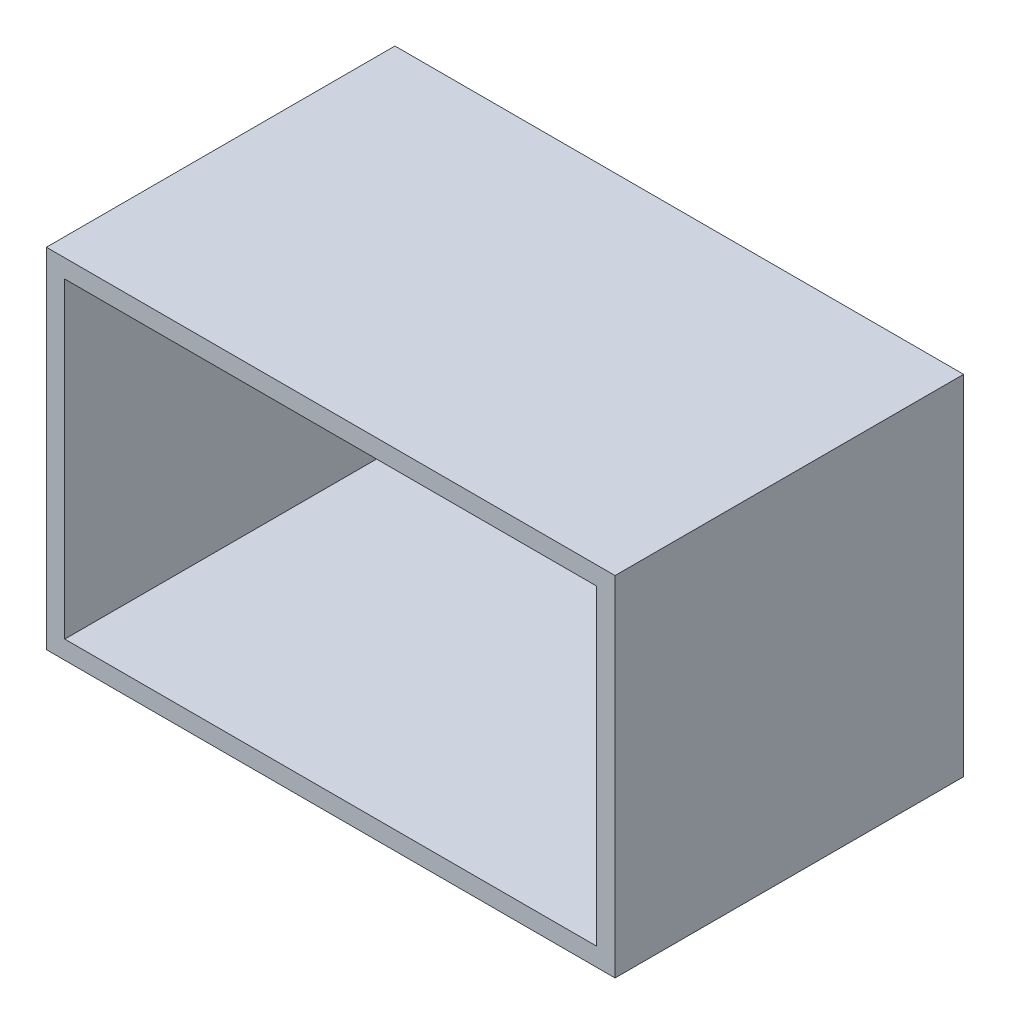
ISO-10303-21;
HEADER;
FILE_DESCRIPTION(('STEP AP214'),'2;1');
FILE_NAME('part.step','',(''),(''),'','','');
FILE_SCHEMA(('AUTOMOTIVE_DESIGN { 1 0 10303 214 1 1 1 1 }'));
ENDSEC;
DATA;
#1=APPLICATION_CONTEXT('core data for automotive mechanical design processes');
#2=APPLICATION_PROTOCOL_DEFINITION('international standard','automotive_design',2000,#1);
#3=PRODUCT_CONTEXT('',#1,'mechanical');
#4=PRODUCT('Part','Part','',(#3));
#5=PRODUCT_RELATED_PRODUCT_CATEGORY('part','',(#4));
#6=PRODUCT_DEFINITION_FORMATION('','',#4);
#7=PRODUCT_DEFINITION_CONTEXT('part definition',#1,'design');
#8=PRODUCT_DEFINITION('design','',#6,#7);
#9=PRODUCT_DEFINITION_SHAPE('','',#8);
#10=(LENGTH_UNIT() NAMED_UNIT(*) SI_UNIT(.MILLI.,.METRE.));
#11=(NAMED_UNIT(*) PLANE_ANGLE_UNIT() SI_UNIT($,.RADIAN.));
#12=(NAMED_UNIT(*) SI_UNIT($,.STERADIAN.) SOLID_ANGLE_UNIT());
#13=UNCERTAINTY_MEASURE_WITH_UNIT(LENGTH_MEASURE(1.E-05),#10,'distance_accuracy_value','');
#14=(GEOMETRIC_REPRESENTATION_CONTEXT(3) GLOBAL_UNCERTAINTY_ASSIGNED_CONTEXT((#13)) GLOBAL_UNIT_ASSIGNED_CONTEXT((#10,
#11,#12)) REPRESENTATION_CONTEXT('',''));
#15=CARTESIAN_POINT('',(0.,0.,0.));
#16=DIRECTION('',(0.,0.,1.));
#17=DIRECTION('',(1.,0.,0.));
#18=AXIS2_PLACEMENT_3D('',#15,#16,#17);
#19=CARTESIAN_POINT('',(-15.5,-9.5,19.));
#20=DIRECTION('',(1.,0.,0.));
#21=DIRECTION('',(0.,0.,-1.));
#22=AXIS2_PLACEMENT_3D('',#19,#20,#21);
#23=PLANE('',#22);
#24=DIRECTION('',(0.,-1.,0.));
#25=VECTOR('',#24,1.);
#26=CARTESIAN_POINT('',(-15.5,-9.5,0.));
#27=LINE('',#26,#25);
#28=CARTESIAN_POINT('',(-15.5,9.5,0.));
#29=VERTEX_POINT('',#28);
#30=CARTESIAN_POINT('',(-15.5,-9.5,0.));
#31=VERTEX_POINT('',#30);
#32=EDGE_CURVE('E150',#29,#31,#27,.T.);
#33=ORIENTED_EDGE('',*,*,#32,.T.);
#34=DIRECTION('',(0.,0.,-1.));
#35=VECTOR('',#34,1.);
#36=CARTESIAN_POINT('',(-15.5,-9.5,19.));
#37=LINE('',#36,#35);
#38=CARTESIAN_POINT('',(-15.5,-9.5,19.));
#39=VERTEX_POINT('',#38);
#40=EDGE_CURVE('E11',#39,#31,#37,.T.);
#41=ORIENTED_EDGE('',*,*,#40,.F.);
#42=DIRECTION('',(0.,-1.,0.));
#43=VECTOR('',#42,1.);
#44=CARTESIAN_POINT('',(-15.5,-9.5,19.));
#45=LINE('',#44,#43);
#46=CARTESIAN_POINT('',(-15.5,9.5,19.));
#47=VERTEX_POINT('',#46);
#48=EDGE_CURVE('E143',#47,#39,#45,.T.);
#49=ORIENTED_EDGE('',*,*,#48,.F.);
#50=DIRECTION('',(0.,0.,-1.));
#51=VECTOR('',#50,1.);
#52=CARTESIAN_POINT('',(-15.5,9.5,19.));
#53=LINE('',#52,#51);
#54=EDGE_CURVE('E149',#47,#29,#53,.T.);
#55=ORIENTED_EDGE('',*,*,#54,.T.);
#56=EDGE_LOOP('',(#33,#41,#49,#55));
#57=FACE_BOUND('',#56,.T.);
#58=ADVANCED_FACE('F36',(#57),#23,.F.);
#59=CARTESIAN_POINT('',(15.5,-9.5,19.));
#60=DIRECTION('',(0.,1.,0.));
#61=DIRECTION('',(0.,0.,1.));
#62=AXIS2_PLACEMENT_3D('',#59,#60,#61);
#63=PLANE('',#62);
#64=DIRECTION('',(1.,0.,0.));
#65=VECTOR('',#64,1.);
#66=CARTESIAN_POINT('',(15.5,-9.5,0.));
#67=LINE('',#66,#65);
#68=CARTESIAN_POINT('',(15.5,-9.5,0.));
#69=VERTEX_POINT('',#68);
#70=EDGE_CURVE('E153',#31,#69,#67,.T.);
#71=ORIENTED_EDGE('',*,*,#70,.T.);
#72=DIRECTION('',(0.,0.,-1.));
#73=VECTOR('',#72,1.);
#74=CARTESIAN_POINT('',(15.5,-9.5,19.));
#75=LINE('',#74,#73);
#76=CARTESIAN_POINT('',(15.5,-9.5,19.));
#77=VERTEX_POINT('',#76);
#78=EDGE_CURVE('E43',#77,#69,#75,.T.);
#79=ORIENTED_EDGE('',*,*,#78,.F.);
#80=DIRECTION('',(1.,0.,0.));
#81=VECTOR('',#80,1.);
#82=CARTESIAN_POINT('',(15.5,-9.5,19.));
#83=LINE('',#82,#81);
#84=EDGE_CURVE('E87',#39,#77,#83,.T.);
#85=ORIENTED_EDGE('',*,*,#84,.F.);
#86=ORIENTED_EDGE('',*,*,#40,.T.);
#87=EDGE_LOOP('',(#71,#79,#85,#86));
#88=FACE_BOUND('',#87,.T.);
#89=ADVANCED_FACE('F182',(#88),#63,.F.);
#90=CARTESIAN_POINT('',(15.5,-9.5,19.));
#91=DIRECTION('',(-1.,0.,0.));
#92=DIRECTION('',(0.,0.,1.));
#93=AXIS2_PLACEMENT_3D('',#90,#91,#92);
#94=PLANE('',#93);
#95=DIRECTION('',(0.,1.,0.));
#96=VECTOR('',#95,1.);
#97=CARTESIAN_POINT('',(15.5,-9.5,0.));
#98=LINE('',#97,#96);
#99=CARTESIAN_POINT('',(15.5,9.5,0.));
#100=VERTEX_POINT('',#99);
#101=EDGE_CURVE('E155',#69,#100,#98,.T.);
#102=ORIENTED_EDGE('',*,*,#101,.T.);
#103=DIRECTION('',(0.,0.,-1.));
#104=VECTOR('',#103,1.);
#105=CARTESIAN_POINT('',(15.5,9.5,19.));
#106=LINE('',#105,#104);
#107=CARTESIAN_POINT('',(15.5,9.5,19.));
#108=VERTEX_POINT('',#107);
#109=EDGE_CURVE('E159',#108,#100,#106,.T.);
#110=ORIENTED_EDGE('',*,*,#109,.F.);
#111=DIRECTION('',(0.,1.,0.));
#112=VECTOR('',#111,1.);
#113=CARTESIAN_POINT('',(15.5,-9.5,19.));
#114=LINE('',#113,#112);
#115=EDGE_CURVE('E146',#77,#108,#114,.T.);
#116=ORIENTED_EDGE('',*,*,#115,.F.);
#117=ORIENTED_EDGE('',*,*,#78,.T.);
#118=EDGE_LOOP('',(#102,#110,#116,#117));
#119=FACE_BOUND('',#118,.T.);
#120=ADVANCED_FACE('F164',(#119),#94,.F.);
#121=CARTESIAN_POINT('',(15.5,9.5,19.));
#122=DIRECTION('',(0.,-1.,0.));
#123=DIRECTION('',(0.,0.,-1.));
#124=AXIS2_PLACEMENT_3D('',#121,#122,#123);
#125=PLANE('',#124);
#126=DIRECTION('',(-1.,0.,0.));
#127=VECTOR('',#126,1.);
#128=CARTESIAN_POINT('',(15.5,9.5,0.));
#129=LINE('',#128,#127);
#130=EDGE_CURVE('E80',#100,#29,#129,.T.);
#131=ORIENTED_EDGE('',*,*,#130,.T.);
#132=ORIENTED_EDGE('',*,*,#54,.F.);
#133=DIRECTION('',(-1.,0.,0.));
#134=VECTOR('',#133,1.);
#135=CARTESIAN_POINT('',(15.5,9.5,19.));
#136=LINE('',#135,#134);
#137=EDGE_CURVE('E59',#108,#47,#136,.T.);
#138=ORIENTED_EDGE('',*,*,#137,.F.);
#139=ORIENTED_EDGE('',*,*,#109,.T.);
#140=EDGE_LOOP('',(#131,#132,#138,#139));
#141=FACE_BOUND('',#140,.T.);
#142=ADVANCED_FACE('F172',(#141),#125,.F.);
#143=CARTESIAN_POINT('',(0.,0.,19.));
#144=DIRECTION('',(0.,0.,1.));
#145=DIRECTION('',(1.,0.,0.));
#146=AXIS2_PLACEMENT_3D('',#143,#144,#145);
#147=PLANE('',#146);
#148=DIRECTION('',(0.,-1.,0.));
#149=VECTOR('',#148,1.);
#150=CARTESIAN_POINT('',(-14.5,-9.5,19.));
#151=LINE('',#150,#149);
#152=CARTESIAN_POINT('',(-14.5,8.5,19.));
#153=VERTEX_POINT('',#152);
#154=CARTESIAN_POINT('',(-14.5,-8.5,19.));
#155=VERTEX_POINT('',#154);
#156=EDGE_CURVE('E132',#153,#155,#151,.T.);
#157=ORIENTED_EDGE('',*,*,#156,.F.);
#158=DIRECTION('',(-1.,0.,0.));
#159=VECTOR('',#158,1.);
#160=CARTESIAN_POINT('',(15.5,8.5,19.));
#161=LINE('',#160,#159);
#162=CARTESIAN_POINT('',(14.5,8.5,19.));
#163=VERTEX_POINT('',#162);
#164=EDGE_CURVE('E141',#163,#153,#161,.T.);
#165=ORIENTED_EDGE('',*,*,#164,.F.);
#166=DIRECTION('',(0.,1.,0.));
#167=VECTOR('',#166,1.);
#168=CARTESIAN_POINT('',(14.5,-9.5,19.));
#169=LINE('',#168,#167);
#170=CARTESIAN_POINT('',(14.5,-8.5,19.));
#171=VERTEX_POINT('',#170);
#172=EDGE_CURVE('E139',#171,#163,#169,.T.);
#173=ORIENTED_EDGE('',*,*,#172,.F.);
#174=DIRECTION('',(1.,0.,0.));
#175=VECTOR('',#174,1.);
#176=CARTESIAN_POINT('',(15.5,-8.5,19.));
#177=LINE('',#176,#175);
#178=EDGE_CURVE('E124',#155,#171,#177,.T.);
#179=ORIENTED_EDGE('',*,*,#178,.F.);
#180=EDGE_LOOP('',(#157,#165,#173,#179));
#181=FACE_BOUND('',#180,.T.);
#182=ORIENTED_EDGE('',*,*,#48,.T.);
#183=ORIENTED_EDGE('',*,*,#84,.T.);
#184=ORIENTED_EDGE('',*,*,#115,.T.);
#185=ORIENTED_EDGE('',*,*,#137,.T.);
#186=EDGE_LOOP('',(#182,#183,#184,#185));
#187=FACE_BOUND('',#186,.T.);
#188=ADVANCED_FACE('F174',(#181,#187),#147,.T.);
#189=CARTESIAN_POINT('',(0.,0.,0.));
#190=DIRECTION('',(0.,0.,1.));
#191=DIRECTION('',(1.,0.,0.));
#192=AXIS2_PLACEMENT_3D('',#189,#190,#191);
#193=PLANE('',#192);
#194=ORIENTED_EDGE('',*,*,#32,.F.);
#195=ORIENTED_EDGE('',*,*,#130,.F.);
#196=ORIENTED_EDGE('',*,*,#101,.F.);
#197=ORIENTED_EDGE('',*,*,#70,.F.);
#198=EDGE_LOOP('',(#194,#195,#196,#197));
#199=FACE_BOUND('',#198,.T.);
#200=ADVANCED_FACE('F168',(#199),#193,.F.);
#201=CARTESIAN_POINT('',(-14.5,-9.5,19.));
#202=DIRECTION('',(1.,0.,0.));
#203=DIRECTION('',(0.,0.,-1.));
#204=AXIS2_PLACEMENT_3D('',#201,#202,#203);
#205=PLANE('',#204);
#206=DIRECTION('',(0.,-1.,0.));
#207=VECTOR('',#206,1.);
#208=CARTESIAN_POINT('',(-14.5,-9.5,1.));
#209=LINE('',#208,#207);
#210=CARTESIAN_POINT('',(-14.5,8.5,1.));
#211=VERTEX_POINT('',#210);
#212=CARTESIAN_POINT('',(-14.5,-8.5,1.));
#213=VERTEX_POINT('',#212);
#214=EDGE_CURVE('E115',#211,#213,#209,.T.);
#215=ORIENTED_EDGE('',*,*,#214,.F.);
#216=DIRECTION('',(0.,0.,-1.));
#217=VECTOR('',#216,1.);
#218=CARTESIAN_POINT('',(-14.5,8.5,19.));
#219=LINE('',#218,#217);
#220=EDGE_CURVE('E135',#153,#211,#219,.T.);
#221=ORIENTED_EDGE('',*,*,#220,.F.);
#222=ORIENTED_EDGE('',*,*,#156,.T.);
#223=DIRECTION('',(0.,0.,-1.));
#224=VECTOR('',#223,1.);
#225=CARTESIAN_POINT('',(-14.5,-8.5,19.));
#226=LINE('',#225,#224);
#227=EDGE_CURVE('E127',#155,#213,#226,.T.);
#228=ORIENTED_EDGE('',*,*,#227,.T.);
#229=EDGE_LOOP('',(#215,#221,#222,#228));
#230=FACE_BOUND('',#229,.T.);
#231=ADVANCED_FACE('F209',(#230),#205,.T.);
#232=CARTESIAN_POINT('',(15.5,-8.5,19.));
#233=DIRECTION('',(0.,1.,0.));
#234=DIRECTION('',(0.,0.,1.));
#235=AXIS2_PLACEMENT_3D('',#232,#233,#234);
#236=PLANE('',#235);
#237=DIRECTION('',(1.,0.,0.));
#238=VECTOR('',#237,1.);
#239=CARTESIAN_POINT('',(15.5,-8.5,1.));
#240=LINE('',#239,#238);
#241=CARTESIAN_POINT('',(14.5,-8.5,1.));
#242=VERTEX_POINT('',#241);
#243=EDGE_CURVE('E109',#213,#242,#240,.T.);
#244=ORIENTED_EDGE('',*,*,#243,.F.);
#245=ORIENTED_EDGE('',*,*,#227,.F.);
#246=ORIENTED_EDGE('',*,*,#178,.T.);
#247=DIRECTION('',(0.,0.,-1.));
#248=VECTOR('',#247,1.);
#249=CARTESIAN_POINT('',(14.5,-8.5,19.));
#250=LINE('',#249,#248);
#251=EDGE_CURVE('E121',#171,#242,#250,.T.);
#252=ORIENTED_EDGE('',*,*,#251,.T.);
#253=EDGE_LOOP('',(#244,#245,#246,#252));
#254=FACE_BOUND('',#253,.T.);
#255=ADVANCED_FACE('F122',(#254),#236,.T.);
#256=CARTESIAN_POINT('',(14.5,-9.5,19.));
#257=DIRECTION('',(-1.,0.,0.));
#258=DIRECTION('',(0.,0.,1.));
#259=AXIS2_PLACEMENT_3D('',#256,#257,#258);
#260=PLANE('',#259);
#261=DIRECTION('',(0.,1.,0.));
#262=VECTOR('',#261,1.);
#263=CARTESIAN_POINT('',(14.5,-9.5,1.));
#264=LINE('',#263,#262);
#265=CARTESIAN_POINT('',(14.5,8.5,1.));
#266=VERTEX_POINT('',#265);
#267=EDGE_CURVE('E113',#242,#266,#264,.T.);
#268=ORIENTED_EDGE('',*,*,#267,.F.);
#269=ORIENTED_EDGE('',*,*,#251,.F.);
#270=ORIENTED_EDGE('',*,*,#172,.T.);
#271=DIRECTION('',(0.,0.,-1.));
#272=VECTOR('',#271,1.);
#273=CARTESIAN_POINT('',(14.5,8.5,19.));
#274=LINE('',#273,#272);
#275=EDGE_CURVE('E50',#163,#266,#274,.T.);
#276=ORIENTED_EDGE('',*,*,#275,.T.);
#277=EDGE_LOOP('',(#268,#269,#270,#276));
#278=FACE_BOUND('',#277,.T.);
#279=ADVANCED_FACE('F129',(#278),#260,.T.);
#280=CARTESIAN_POINT('',(15.5,8.5,19.));
#281=DIRECTION('',(0.,-1.,0.));
#282=DIRECTION('',(0.,0.,-1.));
#283=AXIS2_PLACEMENT_3D('',#280,#281,#282);
#284=PLANE('',#283);
#285=DIRECTION('',(-1.,0.,0.));
#286=VECTOR('',#285,1.);
#287=CARTESIAN_POINT('',(15.5,8.5,1.));
#288=LINE('',#287,#286);
#289=EDGE_CURVE('E130',#266,#211,#288,.T.);
#290=ORIENTED_EDGE('',*,*,#289,.F.);
#291=ORIENTED_EDGE('',*,*,#275,.F.);
#292=ORIENTED_EDGE('',*,*,#164,.T.);
#293=ORIENTED_EDGE('',*,*,#220,.T.);
#294=EDGE_LOOP('',(#290,#291,#292,#293));
#295=FACE_BOUND('',#294,.T.);
#296=ADVANCED_FACE('F239',(#295),#284,.T.);
#297=CARTESIAN_POINT('',(0.,0.,1.));
#298=DIRECTION('',(0.,0.,1.));
#299=DIRECTION('',(1.,0.,0.));
#300=AXIS2_PLACEMENT_3D('',#297,#298,#299);
#301=PLANE('',#300);
#302=ORIENTED_EDGE('',*,*,#214,.T.);
#303=ORIENTED_EDGE('',*,*,#243,.T.);
#304=ORIENTED_EDGE('',*,*,#267,.T.);
#305=ORIENTED_EDGE('',*,*,#289,.T.);
#306=EDGE_LOOP('',(#302,#303,#304,#305));
#307=FACE_BOUND('',#306,.T.);
#308=ADVANCED_FACE('F111',(#307),#301,.T.);
#309=CLOSED_SHELL('',(#58,#89,#120,#142,#188,#200,#231,#255,#279,#296,#308));
#310=MANIFOLD_SOLID_BREP('B2',#309);
#311=ADVANCED_BREP_SHAPE_REPRESENTATION('',(#18,#310),#14);
#312=SHAPE_DEFINITION_REPRESENTATION(#9,#311);
ENDSEC;
END-ISO-10303-21;
